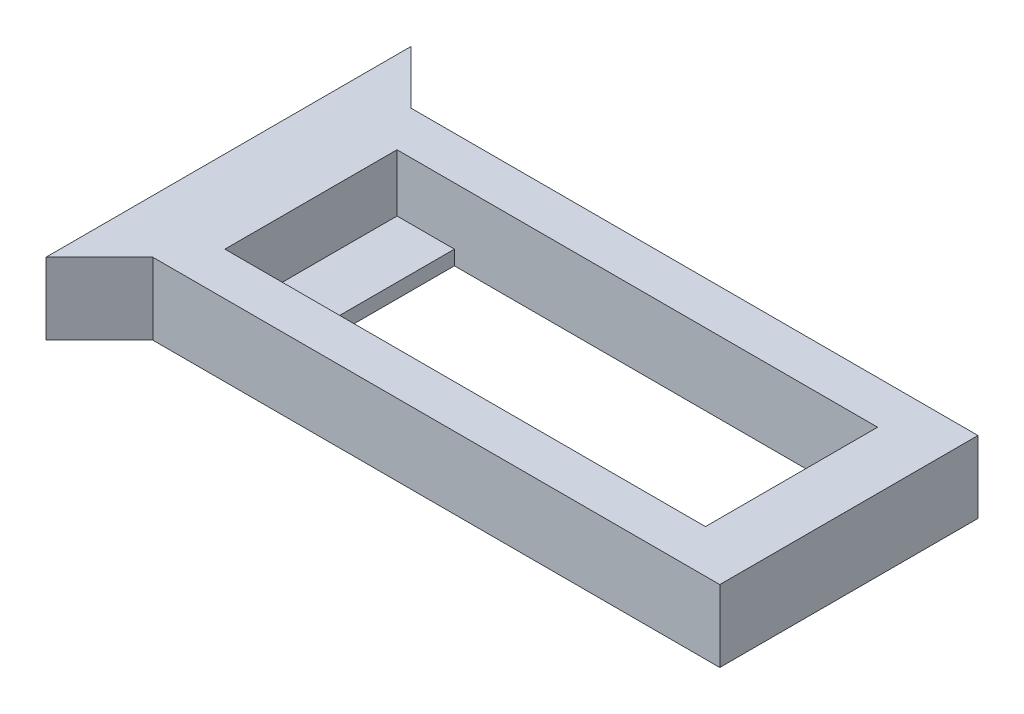
ISO-10303-21;
HEADER;
FILE_DESCRIPTION(('STEP AP214'),'2;1');
FILE_NAME('part.step','',(''),(''),'','','');
FILE_SCHEMA(('AUTOMOTIVE_DESIGN { 1 0 10303 214 1 1 1 1 }'));
ENDSEC;
DATA;
#1=APPLICATION_CONTEXT('core data for automotive mechanical design processes');
#2=APPLICATION_PROTOCOL_DEFINITION('international standard','automotive_design',2000,#1);
#3=PRODUCT_CONTEXT('',#1,'mechanical');
#4=PRODUCT('Part','Part','',(#3));
#5=PRODUCT_RELATED_PRODUCT_CATEGORY('part','',(#4));
#6=PRODUCT_DEFINITION_FORMATION('','',#4);
#7=PRODUCT_DEFINITION_CONTEXT('part definition',#1,'design');
#8=PRODUCT_DEFINITION('design','',#6,#7);
#9=PRODUCT_DEFINITION_SHAPE('','',#8);
#10=(LENGTH_UNIT() NAMED_UNIT(*) SI_UNIT(.MILLI.,.METRE.));
#11=(NAMED_UNIT(*) PLANE_ANGLE_UNIT() SI_UNIT($,.RADIAN.));
#12=(NAMED_UNIT(*) SI_UNIT($,.STERADIAN.) SOLID_ANGLE_UNIT());
#13=UNCERTAINTY_MEASURE_WITH_UNIT(LENGTH_MEASURE(1.E-05),#10,'distance_accuracy_value','');
#14=(GEOMETRIC_REPRESENTATION_CONTEXT(3) GLOBAL_UNCERTAINTY_ASSIGNED_CONTEXT((#13)) GLOBAL_UNIT_ASSIGNED_CONTEXT((#10,
#11,#12)) REPRESENTATION_CONTEXT('',''));
#15=CARTESIAN_POINT('',(0.,0.,0.));
#16=DIRECTION('',(0.,0.,1.));
#17=DIRECTION('',(1.,0.,0.));
#18=AXIS2_PLACEMENT_3D('',#15,#16,#17);
#19=CARTESIAN_POINT('',(0.,-4.,0.));
#20=DIRECTION('',(0.,-1.,0.));
#21=DIRECTION('',(1.,0.,0.));
#22=AXIS2_PLACEMENT_3D('',#19,#20,#21);
#23=PLANE('',#22);
#24=DIRECTION('',(0.,0.,-1.));
#25=VECTOR('',#24,1.);
#26=CARTESIAN_POINT('',(13.625,-4.,3.));
#27=LINE('',#26,#25);
#28=CARTESIAN_POINT('',(13.625,-4.,6.50000000000001));
#29=VERTEX_POINT('',#28);
#30=CARTESIAN_POINT('',(13.625,-4.,3.));
#31=VERTEX_POINT('',#30);
#32=EDGE_CURVE('E270',#29,#31,#27,.T.);
#33=ORIENTED_EDGE('',*,*,#32,.F.);
#34=DIRECTION('',(-1.,0.,0.));
#35=VECTOR('',#34,1.);
#36=CARTESIAN_POINT('',(18.625,-4.,6.50000000000001));
#37=LINE('',#36,#35);
#38=CARTESIAN_POINT('',(17.625,-4.,6.50000000000001));
#39=VERTEX_POINT('',#38);
#40=EDGE_CURVE('E233',#39,#29,#37,.T.);
#41=ORIENTED_EDGE('',*,*,#40,.F.);
#42=DIRECTION('',(0.,0.,-1.));
#43=VECTOR('',#42,1.);
#44=CARTESIAN_POINT('',(17.625,-4.,3.));
#45=LINE('',#44,#43);
#46=CARTESIAN_POINT('',(17.625,-4.,3.));
#47=VERTEX_POINT('',#46);
#48=EDGE_CURVE('E307',#39,#47,#45,.T.);
#49=ORIENTED_EDGE('',*,*,#48,.T.);
#50=DIRECTION('',(-1.,0.,0.));
#51=VECTOR('',#50,1.);
#52=CARTESIAN_POINT('',(17.625,-4.,3.));
#53=LINE('',#52,#51);
#54=EDGE_CURVE('E313',#47,#31,#53,.T.);
#55=ORIENTED_EDGE('',*,*,#54,.T.);
#56=EDGE_LOOP('',(#33,#41,#49,#55));
#57=FACE_BOUND('',#56,.T.);
#58=ADVANCED_FACE('F45',(#57),#23,.F.);
#59=CARTESIAN_POINT('',(13.625,-5.00907777029563,3.));
#60=DIRECTION('',(1.,0.,0.));
#61=DIRECTION('',(0.,0.,-1.));
#62=AXIS2_PLACEMENT_3D('',#59,#60,#61);
#63=PLANE('',#62);
#64=DIRECTION('',(0.,0.,1.));
#65=VECTOR('',#64,1.);
#66=CARTESIAN_POINT('',(13.625,-5.00807777029562,3.));
#67=LINE('',#66,#65);
#68=CARTESIAN_POINT('',(13.625,-5.00807777029562,3.));
#69=VERTEX_POINT('',#68);
#70=CARTESIAN_POINT('',(13.625,-5.00807777029562,6.50000000000001));
#71=VERTEX_POINT('',#70);
#72=EDGE_CURVE('E266',#69,#71,#67,.T.);
#73=ORIENTED_EDGE('',*,*,#72,.T.);
#74=DIRECTION('',(0.,1.,0.));
#75=VECTOR('',#74,1.);
#76=CARTESIAN_POINT('',(13.625,-5.00907777029563,6.50000000000001));
#77=LINE('',#76,#75);
#78=EDGE_CURVE('E239',#71,#29,#77,.T.);
#79=ORIENTED_EDGE('',*,*,#78,.T.);
#80=ORIENTED_EDGE('',*,*,#32,.T.);
#81=DIRECTION('',(0.,1.,0.));
#82=VECTOR('',#81,1.);
#83=CARTESIAN_POINT('',(13.625,-5.00907777029563,3.));
#84=LINE('',#83,#82);
#85=EDGE_CURVE('E279',#69,#31,#84,.T.);
#86=ORIENTED_EDGE('',*,*,#85,.F.);
#87=EDGE_LOOP('',(#73,#79,#80,#86));
#88=FACE_BOUND('',#87,.T.);
#89=ADVANCED_FACE('F391',(#88),#63,.F.);
#90=CARTESIAN_POINT('',(17.625,-4.,15.));
#91=VERTEX_POINT('',#90);
#92=CARTESIAN_POINT('',(17.625,-4.,11.5));
#93=VERTEX_POINT('',#92);
#94=EDGE_CURVE('E308',#91,#93,#45,.T.);
#95=ORIENTED_EDGE('',*,*,#94,.T.);
#96=DIRECTION('',(1.,0.,0.));
#97=VECTOR('',#96,1.);
#98=CARTESIAN_POINT('',(18.625,-4.,11.5));
#99=LINE('',#98,#97);
#100=CARTESIAN_POINT('',(13.625,-4.,11.5));
#101=VERTEX_POINT('',#100);
#102=EDGE_CURVE('E225',#101,#93,#99,.T.);
#103=ORIENTED_EDGE('',*,*,#102,.F.);
#104=CARTESIAN_POINT('',(13.625,-4.,15.));
#105=VERTEX_POINT('',#104);
#106=EDGE_CURVE('E271',#105,#101,#27,.T.);
#107=ORIENTED_EDGE('',*,*,#106,.F.);
#108=DIRECTION('',(1.,0.,0.));
#109=VECTOR('',#108,1.);
#110=CARTESIAN_POINT('',(17.625,-4.,15.));
#111=LINE('',#110,#109);
#112=EDGE_CURVE('E301',#105,#91,#111,.T.);
#113=ORIENTED_EDGE('',*,*,#112,.T.);
#114=EDGE_LOOP('',(#95,#103,#107,#113));
#115=FACE_BOUND('',#114,.T.);
#116=ADVANCED_FACE('F395',(#115),#23,.F.);
#117=DIRECTION('',(0.,0.,1.));
#118=VECTOR('',#117,1.);
#119=CARTESIAN_POINT('',(-11.875,-4.,3.));
#120=LINE('',#119,#118);
#121=CARTESIAN_POINT('',(-11.875,-4.,3.));
#122=VERTEX_POINT('',#121);
#123=CARTESIAN_POINT('',(-11.875,-4.,15.));
#124=VERTEX_POINT('',#123);
#125=EDGE_CURVE('E275',#122,#124,#120,.T.);
#126=ORIENTED_EDGE('',*,*,#125,.F.);
#127=CARTESIAN_POINT('',(-15.875,-4.,3.));
#128=VERTEX_POINT('',#127);
#129=EDGE_CURVE('E312',#122,#128,#53,.T.);
#130=ORIENTED_EDGE('',*,*,#129,.T.);
#131=DIRECTION('',(0.,0.,1.));
#132=VECTOR('',#131,1.);
#133=CARTESIAN_POINT('',(-15.875,-4.,3.));
#134=LINE('',#133,#132);
#135=CARTESIAN_POINT('',(-15.875,-4.,15.));
#136=VERTEX_POINT('',#135);
#137=EDGE_CURVE('E297',#128,#136,#134,.T.);
#138=ORIENTED_EDGE('',*,*,#137,.T.);
#139=EDGE_CURVE('E303',#136,#124,#111,.T.);
#140=ORIENTED_EDGE('',*,*,#139,.T.);
#141=EDGE_LOOP('',(#126,#130,#138,#140));
#142=FACE_BOUND('',#141,.T.);
#143=ADVANCED_FACE('F394',(#142),#23,.F.);
#144=CARTESIAN_POINT('',(21.625,0.,18.));
#145=DIRECTION('',(0.,-1.,0.));
#146=DIRECTION('',(1.,0.,0.));
#147=AXIS2_PLACEMENT_3D('',#144,#145,#146);
#148=PLANE('',#147);
#149=DIRECTION('',(1.,0.,0.));
#150=VECTOR('',#149,1.);
#151=CARTESIAN_POINT('',(17.625,0.,15.));
#152=LINE('',#151,#150);
#153=CARTESIAN_POINT('',(-15.875,0.,15.));
#154=VERTEX_POINT('',#153);
#155=CARTESIAN_POINT('',(17.625,0.,15.));
#156=VERTEX_POINT('',#155);
#157=EDGE_CURVE('E320',#154,#156,#152,.T.);
#158=ORIENTED_EDGE('',*,*,#157,.F.);
#159=DIRECTION('',(0.,0.,1.));
#160=VECTOR('',#159,1.);
#161=CARTESIAN_POINT('',(-15.875,0.,3.));
#162=LINE('',#161,#160);
#163=CARTESIAN_POINT('',(-15.875,0.,3.));
#164=VERTEX_POINT('',#163);
#165=EDGE_CURVE('E296',#164,#154,#162,.T.);
#166=ORIENTED_EDGE('',*,*,#165,.F.);
#167=DIRECTION('',(-1.,0.,0.));
#168=VECTOR('',#167,1.);
#169=CARTESIAN_POINT('',(17.625,0.,3.));
#170=LINE('',#169,#168);
#171=CARTESIAN_POINT('',(17.625,0.,3.));
#172=VERTEX_POINT('',#171);
#173=EDGE_CURVE('E302',#172,#164,#170,.T.);
#174=ORIENTED_EDGE('',*,*,#173,.F.);
#175=DIRECTION('',(0.,0.,-1.));
#176=VECTOR('',#175,1.);
#177=CARTESIAN_POINT('',(17.625,0.,3.));
#178=LINE('',#177,#176);
#179=EDGE_CURVE('E324',#156,#172,#178,.T.);
#180=ORIENTED_EDGE('',*,*,#179,.F.);
#181=EDGE_LOOP('',(#158,#166,#174,#180));
#182=FACE_BOUND('',#181,.T.);
#183=DIRECTION('',(-1.,0.,0.));
#184=VECTOR('',#183,1.);
#185=CARTESIAN_POINT('',(21.625,0.,0.));
#186=LINE('',#185,#184);
#187=CARTESIAN_POINT('',(21.625,0.,0.));
#188=VERTEX_POINT('',#187);
#189=CARTESIAN_POINT('',(-17.9034196275094,0.,0.));
#190=VERTEX_POINT('',#189);
#191=EDGE_CURVE('E334',#188,#190,#186,.T.);
#192=ORIENTED_EDGE('',*,*,#191,.T.);
#193=DIRECTION('',(-0.707106781186544,0.,-0.707106781186551));
#194=VECTOR('',#193,1.);
#195=CARTESIAN_POINT('',(-21.625,0.,-3.72158037249067));
#196=LINE('',#195,#194);
#197=CARTESIAN_POINT('',(-21.625,0.,-3.72158037249067));
#198=VERTEX_POINT('',#197);
#199=EDGE_CURVE('E69',#190,#198,#196,.T.);
#200=ORIENTED_EDGE('',*,*,#199,.T.);
#201=DIRECTION('',(0.,0.,-1.));
#202=VECTOR('',#201,1.);
#203=CARTESIAN_POINT('',(-21.625,0.,18.));
#204=LINE('',#203,#202);
#205=CARTESIAN_POINT('',(-21.625,0.,21.7215803724907));
#206=VERTEX_POINT('',#205);
#207=EDGE_CURVE('E11',#206,#198,#204,.T.);
#208=ORIENTED_EDGE('',*,*,#207,.F.);
#209=DIRECTION('',(0.707106781186544,0.,-0.707106781186551));
#210=VECTOR('',#209,1.);
#211=CARTESIAN_POINT('',(-21.625,0.,21.7215803724907));
#212=LINE('',#211,#210);
#213=CARTESIAN_POINT('',(-17.9034196275094,0.,18.));
#214=VERTEX_POINT('',#213);
#215=EDGE_CURVE('E198',#206,#214,#212,.T.);
#216=ORIENTED_EDGE('',*,*,#215,.T.);
#217=DIRECTION('',(-1.,0.,0.));
#218=VECTOR('',#217,1.);
#219=CARTESIAN_POINT('',(21.625,0.,18.));
#220=LINE('',#219,#218);
#221=CARTESIAN_POINT('',(21.625,0.,18.));
#222=VERTEX_POINT('',#221);
#223=EDGE_CURVE('E344',#222,#214,#220,.T.);
#224=ORIENTED_EDGE('',*,*,#223,.F.);
#225=DIRECTION('',(0.,0.,-1.));
#226=VECTOR('',#225,1.);
#227=CARTESIAN_POINT('',(21.625,0.,18.));
#228=LINE('',#227,#226);
#229=EDGE_CURVE('E353',#222,#188,#228,.T.);
#230=ORIENTED_EDGE('',*,*,#229,.T.);
#231=EDGE_LOOP('',(#192,#200,#208,#216,#224,#230));
#232=FACE_BOUND('',#231,.T.);
#233=ADVANCED_FACE('F47',(#182,#232),#148,.F.);
#234=CARTESIAN_POINT('',(-21.625,0.,18.));
#235=DIRECTION('',(1.,0.,0.));
#236=DIRECTION('',(0.,1.,0.));
#237=AXIS2_PLACEMENT_3D('',#234,#235,#236);
#238=PLANE('',#237);
#239=ORIENTED_EDGE('',*,*,#207,.T.);
#240=DIRECTION('',(0.,1.,0.));
#241=VECTOR('',#240,1.);
#242=CARTESIAN_POINT('',(-21.625,-10.2711872065334,-3.72158037249067));
#243=LINE('',#242,#241);
#244=CARTESIAN_POINT('',(-21.625,-5.00807777029563,-3.72158037249067));
#245=VERTEX_POINT('',#244);
#246=EDGE_CURVE('E183',#245,#198,#243,.T.);
#247=ORIENTED_EDGE('',*,*,#246,.F.);
#248=DIRECTION('',(0.,0.,-1.));
#249=VECTOR('',#248,1.);
#250=CARTESIAN_POINT('',(-21.625,-5.00807777029563,18.));
#251=LINE('',#250,#249);
#252=CARTESIAN_POINT('',(-21.625,-5.00807777029563,21.7215803724907));
#253=VERTEX_POINT('',#252);
#254=EDGE_CURVE('E54',#253,#245,#251,.T.);
#255=ORIENTED_EDGE('',*,*,#254,.F.);
#256=DIRECTION('',(0.,1.,0.));
#257=VECTOR('',#256,1.);
#258=CARTESIAN_POINT('',(-21.625,-10.2711872065334,21.7215803724907));
#259=LINE('',#258,#257);
#260=EDGE_CURVE('E181',#253,#206,#259,.T.);
#261=ORIENTED_EDGE('',*,*,#260,.T.);
#262=EDGE_LOOP('',(#239,#247,#255,#261));
#263=FACE_BOUND('',#262,.T.);
#264=ADVANCED_FACE('F179',(#263),#238,.F.);
#265=CARTESIAN_POINT('',(-21.625,-5.00807777029563,18.));
#266=DIRECTION('',(0.,1.,0.));
#267=DIRECTION('',(-1.,0.,0.));
#268=AXIS2_PLACEMENT_3D('',#265,#266,#267);
#269=PLANE('',#268);
#270=DIRECTION('',(0.,0.,1.));
#271=VECTOR('',#270,1.);
#272=CARTESIAN_POINT('',(18.625,-5.00807777029562,6.50000000000001));
#273=LINE('',#272,#271);
#274=CARTESIAN_POINT('',(18.625,-5.00807777029562,6.50000000000001));
#275=VERTEX_POINT('',#274);
#276=CARTESIAN_POINT('',(18.625,-5.00807777029562,11.5));
#277=VERTEX_POINT('',#276);
#278=EDGE_CURVE('E209',#275,#277,#273,.T.);
#279=ORIENTED_EDGE('',*,*,#278,.F.);
#280=DIRECTION('',(1.,0.,0.));
#281=VECTOR('',#280,1.);
#282=CARTESIAN_POINT('',(18.625,-5.00807777029562,6.50000000000001));
#283=LINE('',#282,#281);
#284=EDGE_CURVE('E220',#71,#275,#283,.T.);
#285=ORIENTED_EDGE('',*,*,#284,.F.);
#286=ORIENTED_EDGE('',*,*,#72,.F.);
#287=DIRECTION('',(1.,0.,0.));
#288=VECTOR('',#287,1.);
#289=CARTESIAN_POINT('',(-11.875,-5.00807777029563,3.));
#290=LINE('',#289,#288);
#291=CARTESIAN_POINT('',(-11.875,-5.00807777029563,3.));
#292=VERTEX_POINT('',#291);
#293=EDGE_CURVE('E283',#292,#69,#290,.T.);
#294=ORIENTED_EDGE('',*,*,#293,.F.);
#295=DIRECTION('',(0.,0.,-1.));
#296=VECTOR('',#295,1.);
#297=CARTESIAN_POINT('',(-11.875,-5.00807777029563,3.));
#298=LINE('',#297,#296);
#299=CARTESIAN_POINT('',(-11.875,-5.00807777029563,15.));
#300=VERTEX_POINT('',#299);
#301=EDGE_CURVE('E258',#300,#292,#298,.T.);
#302=ORIENTED_EDGE('',*,*,#301,.F.);
#303=DIRECTION('',(-1.,0.,0.));
#304=VECTOR('',#303,1.);
#305=CARTESIAN_POINT('',(-11.875,-5.00807777029563,15.));
#306=LINE('',#305,#304);
#307=CARTESIAN_POINT('',(13.625,-5.00807777029562,15.));
#308=VERTEX_POINT('',#307);
#309=EDGE_CURVE('E261',#308,#300,#306,.T.);
#310=ORIENTED_EDGE('',*,*,#309,.F.);
#311=CARTESIAN_POINT('',(13.625,-5.00807777029562,11.5));
#312=VERTEX_POINT('',#311);
#313=EDGE_CURVE('E265',#312,#308,#67,.T.);
#314=ORIENTED_EDGE('',*,*,#313,.F.);
#315=DIRECTION('',(-1.,0.,0.));
#316=VECTOR('',#315,1.);
#317=CARTESIAN_POINT('',(18.625,-5.00807777029562,11.5));
#318=LINE('',#317,#316);
#319=EDGE_CURVE('E243',#277,#312,#318,.T.);
#320=ORIENTED_EDGE('',*,*,#319,.F.);
#321=EDGE_LOOP('',(#279,#285,#286,#294,#302,#310,#314,#320));
#322=FACE_BOUND('',#321,.T.);
#323=ORIENTED_EDGE('',*,*,#254,.T.);
#324=DIRECTION('',(0.707106781186544,0.,0.707106781186551));
#325=VECTOR('',#324,1.);
#326=CARTESIAN_POINT('',(-21.625,-5.00807777029563,-3.72158037249067));
#327=LINE('',#326,#325);
#328=CARTESIAN_POINT('',(-17.9034196275094,-5.00807777029563,0.));
#329=VERTEX_POINT('',#328);
#330=EDGE_CURVE('E206',#245,#329,#327,.T.);
#331=ORIENTED_EDGE('',*,*,#330,.T.);
#332=DIRECTION('',(1.,0.,0.));
#333=VECTOR('',#332,1.);
#334=CARTESIAN_POINT('',(-21.625,-5.00807777029563,0.));
#335=LINE('',#334,#333);
#336=CARTESIAN_POINT('',(21.625,-5.00807777029562,0.));
#337=VERTEX_POINT('',#336);
#338=EDGE_CURVE('E357',#329,#337,#335,.T.);
#339=ORIENTED_EDGE('',*,*,#338,.T.);
#340=DIRECTION('',(0.,0.,-1.));
#341=VECTOR('',#340,1.);
#342=CARTESIAN_POINT('',(21.625,-5.00807777029562,18.));
#343=LINE('',#342,#341);
#344=CARTESIAN_POINT('',(21.625,-5.00807777029562,18.));
#345=VERTEX_POINT('',#344);
#346=EDGE_CURVE('E187',#345,#337,#343,.T.);
#347=ORIENTED_EDGE('',*,*,#346,.F.);
#348=DIRECTION('',(1.,0.,0.));
#349=VECTOR('',#348,1.);
#350=CARTESIAN_POINT('',(-21.625,-5.00807777029563,18.));
#351=LINE('',#350,#349);
#352=CARTESIAN_POINT('',(-17.9034196275094,-5.00807777029563,18.));
#353=VERTEX_POINT('',#352);
#354=EDGE_CURVE('E192',#353,#345,#351,.T.);
#355=ORIENTED_EDGE('',*,*,#354,.F.);
#356=DIRECTION('',(-0.707106781186544,0.,0.707106781186551));
#357=VECTOR('',#356,1.);
#358=CARTESIAN_POINT('',(-21.625,-5.00807777029563,21.7215803724907));
#359=LINE('',#358,#357);
#360=EDGE_CURVE('E189',#353,#253,#359,.T.);
#361=ORIENTED_EDGE('',*,*,#360,.T.);
#362=EDGE_LOOP('',(#323,#331,#339,#347,#355,#361));
#363=FACE_BOUND('',#362,.T.);
#364=ADVANCED_FACE('F190',(#322,#363),#269,.F.);
#365=CARTESIAN_POINT('',(21.625,-5.00807777029562,18.));
#366=DIRECTION('',(-1.,0.,0.));
#367=DIRECTION('',(0.,-1.,0.));
#368=AXIS2_PLACEMENT_3D('',#365,#366,#367);
#369=PLANE('',#368);
#370=DIRECTION('',(0.,1.,0.));
#371=VECTOR('',#370,1.);
#372=CARTESIAN_POINT('',(21.625,-5.00807777029562,0.));
#373=LINE('',#372,#371);
#374=EDGE_CURVE('E347',#337,#188,#373,.T.);
#375=ORIENTED_EDGE('',*,*,#374,.T.);
#376=ORIENTED_EDGE('',*,*,#229,.F.);
#377=DIRECTION('',(0.,1.,0.));
#378=VECTOR('',#377,1.);
#379=CARTESIAN_POINT('',(21.625,-5.00807777029562,18.));
#380=LINE('',#379,#378);
#381=EDGE_CURVE('E350',#345,#222,#380,.T.);
#382=ORIENTED_EDGE('',*,*,#381,.F.);
#383=ORIENTED_EDGE('',*,*,#346,.T.);
#384=EDGE_LOOP('',(#375,#376,#382,#383));
#385=FACE_BOUND('',#384,.T.);
#386=ADVANCED_FACE('F370',(#385),#369,.F.);
#387=CARTESIAN_POINT('',(0.,0.,18.));
#388=DIRECTION('',(0.,0.,1.));
#389=DIRECTION('',(1.,0.,0.));
#390=AXIS2_PLACEMENT_3D('',#387,#388,#389);
#391=PLANE('',#390);
#392=DIRECTION('',(0.,1.,0.));
#393=VECTOR('',#392,1.);
#394=CARTESIAN_POINT('',(-17.9034196275094,-10.2711872065334,18.));
#395=LINE('',#394,#393);
#396=EDGE_CURVE('E61',#353,#214,#395,.T.);
#397=ORIENTED_EDGE('',*,*,#396,.F.);
#398=ORIENTED_EDGE('',*,*,#354,.T.);
#399=ORIENTED_EDGE('',*,*,#381,.T.);
#400=ORIENTED_EDGE('',*,*,#223,.T.);
#401=EDGE_LOOP('',(#397,#398,#399,#400));
#402=FACE_BOUND('',#401,.T.);
#403=ADVANCED_FACE('F378',(#402),#391,.T.);
#404=CARTESIAN_POINT('',(0.,0.,0.));
#405=DIRECTION('',(0.,0.,1.));
#406=DIRECTION('',(1.,0.,0.));
#407=AXIS2_PLACEMENT_3D('',#404,#405,#406);
#408=PLANE('',#407);
#409=ORIENTED_EDGE('',*,*,#338,.F.);
#410=DIRECTION('',(0.,1.,0.));
#411=VECTOR('',#410,1.);
#412=CARTESIAN_POINT('',(-17.9034196275094,-10.2711872065334,0.));
#413=LINE('',#412,#411);
#414=EDGE_CURVE('E210',#329,#190,#413,.T.);
#415=ORIENTED_EDGE('',*,*,#414,.T.);
#416=ORIENTED_EDGE('',*,*,#191,.F.);
#417=ORIENTED_EDGE('',*,*,#374,.F.);
#418=EDGE_LOOP('',(#409,#415,#416,#417));
#419=FACE_BOUND('',#418,.T.);
#420=ADVANCED_FACE('F375',(#419),#408,.F.);
#421=CARTESIAN_POINT('',(-15.875,-4.,3.));
#422=DIRECTION('',(-1.,0.,0.));
#423=DIRECTION('',(0.,0.,1.));
#424=AXIS2_PLACEMENT_3D('',#421,#422,#423);
#425=PLANE('',#424);
#426=ORIENTED_EDGE('',*,*,#165,.T.);
#427=DIRECTION('',(0.,1.,0.));
#428=VECTOR('',#427,1.);
#429=CARTESIAN_POINT('',(-15.875,-4.,15.));
#430=LINE('',#429,#428);
#431=EDGE_CURVE('E317',#136,#154,#430,.T.);
#432=ORIENTED_EDGE('',*,*,#431,.F.);
#433=ORIENTED_EDGE('',*,*,#137,.F.);
#434=DIRECTION('',(0.,1.,0.));
#435=VECTOR('',#434,1.);
#436=CARTESIAN_POINT('',(-15.875,-4.,3.));
#437=LINE('',#436,#435);
#438=EDGE_CURVE('E331',#128,#164,#437,.T.);
#439=ORIENTED_EDGE('',*,*,#438,.T.);
#440=EDGE_LOOP('',(#426,#432,#433,#439));
#441=FACE_BOUND('',#440,.T.);
#442=ADVANCED_FACE('F385',(#441),#425,.F.);
#443=CARTESIAN_POINT('',(17.625,-4.,3.));
#444=DIRECTION('',(0.,0.,-1.));
#445=DIRECTION('',(-1.,0.,0.));
#446=AXIS2_PLACEMENT_3D('',#443,#444,#445);
#447=PLANE('',#446);
#448=ORIENTED_EDGE('',*,*,#173,.T.);
#449=ORIENTED_EDGE('',*,*,#438,.F.);
#450=ORIENTED_EDGE('',*,*,#129,.F.);
#451=DIRECTION('',(0.,1.,0.));
#452=VECTOR('',#451,1.);
#453=CARTESIAN_POINT('',(-11.875,-5.00907777029563,3.));
#454=LINE('',#453,#452);
#455=EDGE_CURVE('E287',#292,#122,#454,.T.);
#456=ORIENTED_EDGE('',*,*,#455,.F.);
#457=ORIENTED_EDGE('',*,*,#293,.T.);
#458=ORIENTED_EDGE('',*,*,#85,.T.);
#459=ORIENTED_EDGE('',*,*,#54,.F.);
#460=DIRECTION('',(0.,1.,0.));
#461=VECTOR('',#460,1.);
#462=CARTESIAN_POINT('',(17.625,-4.,3.));
#463=LINE('',#462,#461);
#464=EDGE_CURVE('E335',#47,#172,#463,.T.);
#465=ORIENTED_EDGE('',*,*,#464,.T.);
#466=EDGE_LOOP('',(#448,#449,#450,#456,#457,#458,#459,#465));
#467=FACE_BOUND('',#466,.T.);
#468=ADVANCED_FACE('F450',(#467),#447,.F.);
#469=CARTESIAN_POINT('',(17.625,-4.,3.));
#470=DIRECTION('',(1.,0.,0.));
#471=DIRECTION('',(0.,0.,-1.));
#472=AXIS2_PLACEMENT_3D('',#469,#470,#471);
#473=PLANE('',#472);
#474=ORIENTED_EDGE('',*,*,#179,.T.);
#475=ORIENTED_EDGE('',*,*,#464,.F.);
#476=ORIENTED_EDGE('',*,*,#48,.F.);
#477=DIRECTION('',(0.,0.,-1.));
#478=VECTOR('',#477,1.);
#479=CARTESIAN_POINT('',(17.625,-4.,3.));
#480=LINE('',#479,#478);
#481=EDGE_CURVE('E255',#93,#39,#480,.T.);
#482=ORIENTED_EDGE('',*,*,#481,.F.);
#483=ORIENTED_EDGE('',*,*,#94,.F.);
#484=DIRECTION('',(0.,1.,0.));
#485=VECTOR('',#484,1.);
#486=CARTESIAN_POINT('',(17.625,-4.,15.));
#487=LINE('',#486,#485);
#488=EDGE_CURVE('E338',#91,#156,#487,.T.);
#489=ORIENTED_EDGE('',*,*,#488,.T.);
#490=EDGE_LOOP('',(#474,#475,#476,#482,#483,#489));
#491=FACE_BOUND('',#490,.T.);
#492=ADVANCED_FACE('F417',(#491),#473,.F.);
#493=CARTESIAN_POINT('',(17.625,-4.,15.));
#494=DIRECTION('',(0.,0.,1.));
#495=DIRECTION('',(1.,0.,0.));
#496=AXIS2_PLACEMENT_3D('',#493,#494,#495);
#497=PLANE('',#496);
#498=ORIENTED_EDGE('',*,*,#157,.T.);
#499=ORIENTED_EDGE('',*,*,#488,.F.);
#500=ORIENTED_EDGE('',*,*,#112,.F.);
#501=DIRECTION('',(0.,1.,0.));
#502=VECTOR('',#501,1.);
#503=CARTESIAN_POINT('',(13.625,-5.00907777029563,15.));
#504=LINE('',#503,#502);
#505=EDGE_CURVE('E280',#308,#105,#504,.T.);
#506=ORIENTED_EDGE('',*,*,#505,.F.);
#507=ORIENTED_EDGE('',*,*,#309,.T.);
#508=DIRECTION('',(0.,1.,0.));
#509=VECTOR('',#508,1.);
#510=CARTESIAN_POINT('',(-11.875,-5.00907777029563,15.));
#511=LINE('',#510,#509);
#512=EDGE_CURVE('E284',#300,#124,#511,.T.);
#513=ORIENTED_EDGE('',*,*,#512,.T.);
#514=ORIENTED_EDGE('',*,*,#139,.F.);
#515=ORIENTED_EDGE('',*,*,#431,.T.);
#516=EDGE_LOOP('',(#498,#499,#500,#506,#507,#513,#514,#515));
#517=FACE_BOUND('',#516,.T.);
#518=ADVANCED_FACE('F443',(#517),#497,.F.);
#519=ORIENTED_EDGE('',*,*,#106,.T.);
#520=DIRECTION('',(0.,1.,0.));
#521=VECTOR('',#520,1.);
#522=CARTESIAN_POINT('',(13.625,-5.00907777029563,11.5));
#523=LINE('',#522,#521);
#524=EDGE_CURVE('E238',#312,#101,#523,.T.);
#525=ORIENTED_EDGE('',*,*,#524,.F.);
#526=ORIENTED_EDGE('',*,*,#313,.T.);
#527=ORIENTED_EDGE('',*,*,#505,.T.);
#528=EDGE_LOOP('',(#519,#525,#526,#527));
#529=FACE_BOUND('',#528,.T.);
#530=ADVANCED_FACE('F401',(#529),#63,.F.);
#531=CARTESIAN_POINT('',(-11.875,-5.00907777029563,3.));
#532=DIRECTION('',(-1.,0.,0.));
#533=DIRECTION('',(0.,0.,1.));
#534=AXIS2_PLACEMENT_3D('',#531,#532,#533);
#535=PLANE('',#534);
#536=ORIENTED_EDGE('',*,*,#301,.T.);
#537=ORIENTED_EDGE('',*,*,#455,.T.);
#538=ORIENTED_EDGE('',*,*,#125,.T.);
#539=ORIENTED_EDGE('',*,*,#512,.F.);
#540=EDGE_LOOP('',(#536,#537,#538,#539));
#541=FACE_BOUND('',#540,.T.);
#542=ADVANCED_FACE('F457',(#541),#535,.F.);
#543=CARTESIAN_POINT('',(0.,-4.,0.));
#544=DIRECTION('',(0.,-1.,0.));
#545=DIRECTION('',(1.,0.,0.));
#546=AXIS2_PLACEMENT_3D('',#543,#544,#545);
#547=PLANE('',#546);
#548=ORIENTED_EDGE('',*,*,#481,.T.);
#549=CARTESIAN_POINT('',(18.625,-4.,6.50000000000001));
#550=VERTEX_POINT('',#549);
#551=EDGE_CURVE('E234',#550,#39,#37,.T.);
#552=ORIENTED_EDGE('',*,*,#551,.F.);
#553=DIRECTION('',(0.,0.,-1.));
#554=VECTOR('',#553,1.);
#555=CARTESIAN_POINT('',(18.625,-4.,6.50000000000001));
#556=LINE('',#555,#554);
#557=CARTESIAN_POINT('',(18.625,-4.,11.5));
#558=VERTEX_POINT('',#557);
#559=EDGE_CURVE('E229',#558,#550,#556,.T.);
#560=ORIENTED_EDGE('',*,*,#559,.F.);
#561=EDGE_CURVE('E224',#93,#558,#99,.T.);
#562=ORIENTED_EDGE('',*,*,#561,.F.);
#563=EDGE_LOOP('',(#548,#552,#560,#562));
#564=FACE_BOUND('',#563,.T.);
#565=ADVANCED_FACE('F422',(#564),#547,.T.);
#566=CARTESIAN_POINT('',(18.625,-5.00907777029563,6.50000000000001));
#567=DIRECTION('',(0.,0.,-1.));
#568=DIRECTION('',(-1.,0.,0.));
#569=AXIS2_PLACEMENT_3D('',#566,#567,#568);
#570=PLANE('',#569);
#571=ORIENTED_EDGE('',*,*,#284,.T.);
#572=DIRECTION('',(0.,1.,0.));
#573=VECTOR('',#572,1.);
#574=CARTESIAN_POINT('',(18.625,-5.00907777029563,6.50000000000001));
#575=LINE('',#574,#573);
#576=EDGE_CURVE('E244',#275,#550,#575,.T.);
#577=ORIENTED_EDGE('',*,*,#576,.T.);
#578=ORIENTED_EDGE('',*,*,#551,.T.);
#579=ORIENTED_EDGE('',*,*,#40,.T.);
#580=ORIENTED_EDGE('',*,*,#78,.F.);
#581=EDGE_LOOP('',(#571,#577,#578,#579,#580));
#582=FACE_BOUND('',#581,.T.);
#583=ADVANCED_FACE('F426',(#582),#570,.F.);
#584=CARTESIAN_POINT('',(18.625,-5.00907777029563,6.50000000000001));
#585=DIRECTION('',(1.,0.,0.));
#586=DIRECTION('',(0.,1.,0.));
#587=AXIS2_PLACEMENT_3D('',#584,#585,#586);
#588=PLANE('',#587);
#589=ORIENTED_EDGE('',*,*,#278,.T.);
#590=DIRECTION('',(0.,1.,0.));
#591=VECTOR('',#590,1.);
#592=CARTESIAN_POINT('',(18.625,-5.00907777029563,11.5));
#593=LINE('',#592,#591);
#594=EDGE_CURVE('E247',#277,#558,#593,.T.);
#595=ORIENTED_EDGE('',*,*,#594,.T.);
#596=ORIENTED_EDGE('',*,*,#559,.T.);
#597=ORIENTED_EDGE('',*,*,#576,.F.);
#598=EDGE_LOOP('',(#589,#595,#596,#597));
#599=FACE_BOUND('',#598,.T.);
#600=ADVANCED_FACE('F432',(#599),#588,.F.);
#601=CARTESIAN_POINT('',(18.625,-5.00907777029563,11.5));
#602=DIRECTION('',(0.,0.,1.));
#603=DIRECTION('',(0.,-1.,0.));
#604=AXIS2_PLACEMENT_3D('',#601,#602,#603);
#605=PLANE('',#604);
#606=ORIENTED_EDGE('',*,*,#319,.T.);
#607=ORIENTED_EDGE('',*,*,#524,.T.);
#608=ORIENTED_EDGE('',*,*,#102,.T.);
#609=ORIENTED_EDGE('',*,*,#561,.T.);
#610=ORIENTED_EDGE('',*,*,#594,.F.);
#611=EDGE_LOOP('',(#606,#607,#608,#609,#610));
#612=FACE_BOUND('',#611,.T.);
#613=ADVANCED_FACE('F430',(#612),#605,.F.);
#614=CARTESIAN_POINT('',(-21.625,-10.2711872065334,-3.72158037249067));
#615=DIRECTION('',(0.707106781186551,0.,-0.707106781186544));
#616=DIRECTION('',(-0.707106781186544,0.,-0.707106781186551));
#617=AXIS2_PLACEMENT_3D('',#614,#615,#616);
#618=PLANE('',#617);
#619=ORIENTED_EDGE('',*,*,#330,.F.);
#620=ORIENTED_EDGE('',*,*,#246,.T.);
#621=ORIENTED_EDGE('',*,*,#199,.F.);
#622=ORIENTED_EDGE('',*,*,#414,.F.);
#623=EDGE_LOOP('',(#619,#620,#621,#622));
#624=FACE_BOUND('',#623,.T.);
#625=ADVANCED_FACE('F483',(#624),#618,.T.);
#626=CARTESIAN_POINT('',(-21.625,-10.2711872065334,21.7215803724907));
#627=DIRECTION('',(0.707106781186551,0.,0.707106781186544));
#628=DIRECTION('',(0.707106781186544,0.,-0.707106781186551));
#629=AXIS2_PLACEMENT_3D('',#626,#627,#628);
#630=PLANE('',#629);
#631=ORIENTED_EDGE('',*,*,#360,.F.);
#632=ORIENTED_EDGE('',*,*,#396,.T.);
#633=ORIENTED_EDGE('',*,*,#215,.F.);
#634=ORIENTED_EDGE('',*,*,#260,.F.);
#635=EDGE_LOOP('',(#631,#632,#633,#634));
#636=FACE_BOUND('',#635,.T.);
#637=ADVANCED_FACE('F196',(#636),#630,.T.);
#638=CLOSED_SHELL('',(#58,#89,#116,#143,#233,#264,#364,#386,#403,#420,#442,#468,#492,#518,#530,
#542,#565,#583,#600,#613,#625,#637));
#639=MANIFOLD_SOLID_BREP('B2',#638);
#640=ADVANCED_BREP_SHAPE_REPRESENTATION('',(#18,#639),#14);
#641=SHAPE_DEFINITION_REPRESENTATION(#9,#640);
ENDSEC;
END-ISO-10303-21;
